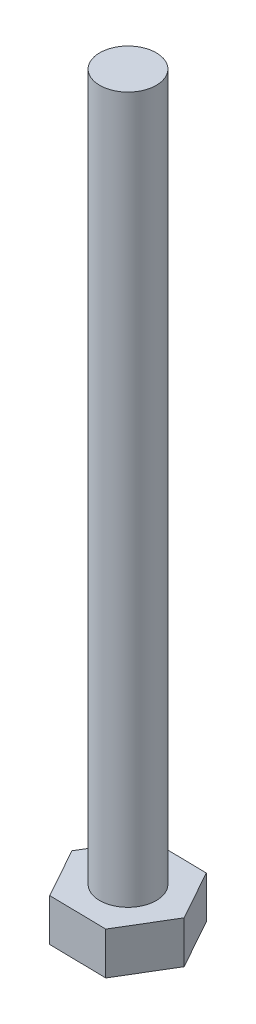
ISO-10303-21;
HEADER;
FILE_DESCRIPTION(('STEP AP214'),'2;1');
FILE_NAME('part.step','',(''),(''),'','','');
FILE_SCHEMA(('AUTOMOTIVE_DESIGN { 1 0 10303 214 1 1 1 1 }'));
ENDSEC;
DATA;
#1=APPLICATION_CONTEXT('core data for automotive mechanical design processes');
#2=APPLICATION_PROTOCOL_DEFINITION('international standard','automotive_design',2000,#1);
#3=PRODUCT_CONTEXT('',#1,'mechanical');
#4=PRODUCT('Part','Part','',(#3));
#5=PRODUCT_RELATED_PRODUCT_CATEGORY('part','',(#4));
#6=PRODUCT_DEFINITION_FORMATION('','',#4);
#7=PRODUCT_DEFINITION_CONTEXT('part definition',#1,'design');
#8=PRODUCT_DEFINITION('design','',#6,#7);
#9=PRODUCT_DEFINITION_SHAPE('','',#8);
#10=(LENGTH_UNIT() NAMED_UNIT(*) SI_UNIT(.MILLI.,.METRE.));
#11=(NAMED_UNIT(*) PLANE_ANGLE_UNIT() SI_UNIT($,.RADIAN.));
#12=(NAMED_UNIT(*) SI_UNIT($,.STERADIAN.) SOLID_ANGLE_UNIT());
#13=UNCERTAINTY_MEASURE_WITH_UNIT(LENGTH_MEASURE(1.E-05),#10,'distance_accuracy_value','');
#14=(GEOMETRIC_REPRESENTATION_CONTEXT(3) GLOBAL_UNCERTAINTY_ASSIGNED_CONTEXT((#13)) GLOBAL_UNIT_ASSIGNED_CONTEXT((#10,
#11,#12)) REPRESENTATION_CONTEXT('',''));
#15=CARTESIAN_POINT('',(0.,0.,0.));
#16=DIRECTION('',(0.,0.,1.));
#17=DIRECTION('',(1.,0.,0.));
#18=AXIS2_PLACEMENT_3D('',#15,#16,#17);
#19=CARTESIAN_POINT('',(-2.08174588782689,3.,3.46405360695373));
#20=DIRECTION('',(0.0175229154353276,0.,-0.999846461930354));
#21=DIRECTION('',(-0.999846461930354,0.,-0.0175229154353276));
#22=AXIS2_PLACEMENT_3D('',#19,#20,#21);
#23=PLANE('',#22);
#24=DIRECTION('',(0.999846461930354,0.,0.0175229154353276));
#25=VECTOR('',#24,1.);
#26=CARTESIAN_POINT('',(-2.08174588782689,0.,3.46405360695373));
#27=LINE('',#26,#25);
#28=CARTESIAN_POINT('',(-2.08174588782689,0.,3.46405360695373));
#29=VERTEX_POINT('',#28);
#30=CARTESIAN_POINT('',(1.9590854797796,0.,3.53487162655874));
#31=VERTEX_POINT('',#30);
#32=EDGE_CURVE('E123',#29,#31,#27,.T.);
#33=ORIENTED_EDGE('',*,*,#32,.T.);
#34=DIRECTION('',(0.,-1.,0.));
#35=VECTOR('',#34,1.);
#36=CARTESIAN_POINT('',(1.9590854797796,3.,3.53487162655874));
#37=LINE('',#36,#35);
#38=CARTESIAN_POINT('',(1.9590854797796,3.,3.53487162655874));
#39=VERTEX_POINT('',#38);
#40=EDGE_CURVE('E40',#39,#31,#37,.T.);
#41=ORIENTED_EDGE('',*,*,#40,.F.);
#42=DIRECTION('',(0.999846461930354,0.,0.0175229154353276));
#43=VECTOR('',#42,1.);
#44=CARTESIAN_POINT('',(-2.08174588782689,3.,3.46405360695373));
#45=LINE('',#44,#43);
#46=CARTESIAN_POINT('',(-2.08174588782689,3.,3.46405360695373));
#47=VERTEX_POINT('',#46);
#48=EDGE_CURVE('E134',#47,#39,#45,.T.);
#49=ORIENTED_EDGE('',*,*,#48,.F.);
#50=DIRECTION('',(0.,-1.,0.));
#51=VECTOR('',#50,1.);
#52=CARTESIAN_POINT('',(-2.08174588782689,3.,3.46405360695373));
#53=LINE('',#52,#51);
#54=EDGE_CURVE('E119',#47,#29,#53,.T.);
#55=ORIENTED_EDGE('',*,*,#54,.T.);
#56=EDGE_LOOP('',(#33,#41,#49,#55));
#57=FACE_BOUND('',#56,.T.);
#58=ADVANCED_FACE('F37',(#57),#23,.F.);
#59=CARTESIAN_POINT('',(1.9590854797796,3.,3.53487162655874));
#60=DIRECTION('',(-0.857130978198013,0.,-0.515098520880537));
#61=DIRECTION('',(-0.515098520880537,0.,0.857130978198013));
#62=AXIS2_PLACEMENT_3D('',#59,#60,#61);
#63=PLANE('',#62);
#64=DIRECTION('',(0.515098520880537,0.,-0.857130978198013));
#65=VECTOR('',#64,1.);
#66=CARTESIAN_POINT('',(1.9590854797796,0.,3.53487162655874));
#67=LINE('',#66,#65);
#68=CARTESIAN_POINT('',(4.04083136760649,0.,0.070818019605012));
#69=VERTEX_POINT('',#68);
#70=EDGE_CURVE('E126',#31,#69,#67,.T.);
#71=ORIENTED_EDGE('',*,*,#70,.T.);
#72=DIRECTION('',(0.,-1.,0.));
#73=VECTOR('',#72,1.);
#74=CARTESIAN_POINT('',(4.04083136760649,3.,0.070818019605012));
#75=LINE('',#74,#73);
#76=CARTESIAN_POINT('',(4.04083136760649,3.,0.070818019605012));
#77=VERTEX_POINT('',#76);
#78=EDGE_CURVE('E137',#77,#69,#75,.T.);
#79=ORIENTED_EDGE('',*,*,#78,.F.);
#80=DIRECTION('',(0.515098520880537,0.,-0.857130978198013));
#81=VECTOR('',#80,1.);
#82=CARTESIAN_POINT('',(1.9590854797796,3.,3.53487162655874));
#83=LINE('',#82,#81);
#84=EDGE_CURVE('E92',#39,#77,#83,.T.);
#85=ORIENTED_EDGE('',*,*,#84,.F.);
#86=ORIENTED_EDGE('',*,*,#40,.T.);
#87=EDGE_LOOP('',(#71,#79,#85,#86));
#88=FACE_BOUND('',#87,.T.);
#89=ADVANCED_FACE('F142',(#88),#63,.F.);
#90=CARTESIAN_POINT('',(4.04083136760649,3.,0.070818019605012));
#91=DIRECTION('',(-0.87465389363334,0.,0.484747941049817));
#92=DIRECTION('',(0.484747941049817,0.,0.874653893633341));
#93=AXIS2_PLACEMENT_3D('',#90,#91,#92);
#94=PLANE('',#93);
#95=DIRECTION('',(-0.484747941049817,0.,-0.874653893633341));
#96=VECTOR('',#95,1.);
#97=CARTESIAN_POINT('',(4.04083136760649,0.,0.070818019605012));
#98=LINE('',#97,#96);
#99=CARTESIAN_POINT('',(2.08174588782689,0.,-3.46405360695373));
#100=VERTEX_POINT('',#99);
#101=EDGE_CURVE('E129',#69,#100,#98,.T.);
#102=ORIENTED_EDGE('',*,*,#101,.T.);
#103=DIRECTION('',(0.,-1.,0.));
#104=VECTOR('',#103,1.);
#105=CARTESIAN_POINT('',(2.08174588782689,3.,-3.46405360695373));
#106=LINE('',#105,#104);
#107=CARTESIAN_POINT('',(2.08174588782689,3.,-3.46405360695373));
#108=VERTEX_POINT('',#107);
#109=EDGE_CURVE('E114',#108,#100,#106,.T.);
#110=ORIENTED_EDGE('',*,*,#109,.F.);
#111=DIRECTION('',(-0.484747941049817,0.,-0.874653893633341));
#112=VECTOR('',#111,1.);
#113=CARTESIAN_POINT('',(4.04083136760649,3.,0.070818019605012));
#114=LINE('',#113,#112);
#115=EDGE_CURVE('E105',#77,#108,#114,.T.);
#116=ORIENTED_EDGE('',*,*,#115,.F.);
#117=ORIENTED_EDGE('',*,*,#78,.T.);
#118=EDGE_LOOP('',(#102,#110,#116,#117));
#119=FACE_BOUND('',#118,.T.);
#120=ADVANCED_FACE('F148',(#119),#94,.F.);
#121=CARTESIAN_POINT('',(2.08174588782689,3.,-3.46405360695373));
#122=DIRECTION('',(-0.0175229154353273,0.,0.999846461930354));
#123=DIRECTION('',(0.999846461930354,0.,0.0175229154353273));
#124=AXIS2_PLACEMENT_3D('',#121,#122,#123);
#125=PLANE('',#124);
#126=DIRECTION('',(-0.999846461930354,0.,-0.0175229154353273));
#127=VECTOR('',#126,1.);
#128=CARTESIAN_POINT('',(2.08174588782689,0.,-3.46405360695373));
#129=LINE('',#128,#127);
#130=CARTESIAN_POINT('',(-1.9590854797796,0.,-3.53487162655875));
#131=VERTEX_POINT('',#130);
#132=EDGE_CURVE('E113',#100,#131,#129,.T.);
#133=ORIENTED_EDGE('',*,*,#132,.T.);
#134=DIRECTION('',(0.,-1.,0.));
#135=VECTOR('',#134,1.);
#136=CARTESIAN_POINT('',(-1.9590854797796,3.,-3.53487162655875));
#137=LINE('',#136,#135);
#138=CARTESIAN_POINT('',(-1.9590854797796,3.,-3.53487162655875));
#139=VERTEX_POINT('',#138);
#140=EDGE_CURVE('E110',#139,#131,#137,.T.);
#141=ORIENTED_EDGE('',*,*,#140,.F.);
#142=DIRECTION('',(-0.999846461930354,0.,-0.0175229154353273));
#143=VECTOR('',#142,1.);
#144=CARTESIAN_POINT('',(2.08174588782689,3.,-3.46405360695373));
#145=LINE('',#144,#143);
#146=EDGE_CURVE('E99',#108,#139,#145,.T.);
#147=ORIENTED_EDGE('',*,*,#146,.F.);
#148=ORIENTED_EDGE('',*,*,#109,.T.);
#149=EDGE_LOOP('',(#133,#141,#147,#148));
#150=FACE_BOUND('',#149,.T.);
#151=ADVANCED_FACE('F111',(#150),#125,.F.);
#152=CARTESIAN_POINT('',(-1.9590854797796,3.,-3.53487162655875));
#153=DIRECTION('',(0.857130978198013,0.,0.515098520880537));
#154=DIRECTION('',(0.515098520880537,0.,-0.857130978198013));
#155=AXIS2_PLACEMENT_3D('',#152,#153,#154);
#156=PLANE('',#155);
#157=DIRECTION('',(-0.515098520880537,0.,0.857130978198013));
#158=VECTOR('',#157,1.);
#159=CARTESIAN_POINT('',(-1.9590854797796,0.,-3.53487162655875));
#160=LINE('',#159,#158);
#161=CARTESIAN_POINT('',(-4.04083136760649,0.,-0.0708180196050144));
#162=VERTEX_POINT('',#161);
#163=EDGE_CURVE('E77',#131,#162,#160,.T.);
#164=ORIENTED_EDGE('',*,*,#163,.T.);
#165=DIRECTION('',(0.,-1.,0.));
#166=VECTOR('',#165,1.);
#167=CARTESIAN_POINT('',(-4.04083136760649,3.,-0.0708180196050144));
#168=LINE('',#167,#166);
#169=CARTESIAN_POINT('',(-4.04083136760649,3.,-0.0708180196050144));
#170=VERTEX_POINT('',#169);
#171=EDGE_CURVE('E115',#170,#162,#168,.T.);
#172=ORIENTED_EDGE('',*,*,#171,.F.);
#173=DIRECTION('',(-0.515098520880537,0.,0.857130978198013));
#174=VECTOR('',#173,1.);
#175=CARTESIAN_POINT('',(-1.9590854797796,3.,-3.53487162655875));
#176=LINE('',#175,#174);
#177=EDGE_CURVE('E103',#139,#170,#176,.T.);
#178=ORIENTED_EDGE('',*,*,#177,.F.);
#179=ORIENTED_EDGE('',*,*,#140,.T.);
#180=EDGE_LOOP('',(#164,#172,#178,#179));
#181=FACE_BOUND('',#180,.T.);
#182=ADVANCED_FACE('F117',(#181),#156,.F.);
#183=CARTESIAN_POINT('',(-4.04083136760649,3.,-0.0708180196050144));
#184=DIRECTION('',(0.874653893633341,0.,-0.484747941049817));
#185=DIRECTION('',(-0.484747941049817,0.,-0.874653893633341));
#186=AXIS2_PLACEMENT_3D('',#183,#184,#185);
#187=PLANE('',#186);
#188=DIRECTION('',(0.484747941049817,0.,0.874653893633341));
#189=VECTOR('',#188,1.);
#190=CARTESIAN_POINT('',(-4.04083136760649,0.,-0.0708180196050144));
#191=LINE('',#190,#189);
#192=EDGE_CURVE('E83',#162,#29,#191,.T.);
#193=ORIENTED_EDGE('',*,*,#192,.T.);
#194=ORIENTED_EDGE('',*,*,#54,.F.);
#195=DIRECTION('',(0.484747941049817,0.,0.874653893633341));
#196=VECTOR('',#195,1.);
#197=CARTESIAN_POINT('',(-4.04083136760649,3.,-0.0708180196050144));
#198=LINE('',#197,#196);
#199=EDGE_CURVE('E54',#170,#47,#198,.T.);
#200=ORIENTED_EDGE('',*,*,#199,.F.);
#201=ORIENTED_EDGE('',*,*,#171,.T.);
#202=EDGE_LOOP('',(#193,#194,#200,#201));
#203=FACE_BOUND('',#202,.T.);
#204=ADVANCED_FACE('F164',(#203),#187,.F.);
#205=CARTESIAN_POINT('',(0.,3.,0.));
#206=DIRECTION('',(0.,1.,0.));
#207=DIRECTION('',(0.,0.,1.));
#208=AXIS2_PLACEMENT_3D('',#205,#206,#207);
#209=PLANE('',#208);
#210=CARTESIAN_POINT('',(0.,3.,0.));
#211=DIRECTION('',(0.,1.,0.));
#212=DIRECTION('',(0.,0.,1.));
#213=AXIS2_PLACEMENT_3D('',#210,#211,#212);
#214=CIRCLE('',#213,2.);
#215=CARTESIAN_POINT('',(0.,3.,2.));
#216=VERTEX_POINT('',#215);
#217=EDGE_CURVE('E11',#216,#216,#214,.T.);
#218=ORIENTED_EDGE('',*,*,#217,.F.);
#219=EDGE_LOOP('',(#218));
#220=FACE_BOUND('',#219,.T.);
#221=ORIENTED_EDGE('',*,*,#48,.T.);
#222=ORIENTED_EDGE('',*,*,#84,.T.);
#223=ORIENTED_EDGE('',*,*,#115,.T.);
#224=ORIENTED_EDGE('',*,*,#146,.T.);
#225=ORIENTED_EDGE('',*,*,#177,.T.);
#226=ORIENTED_EDGE('',*,*,#199,.T.);
#227=EDGE_LOOP('',(#221,#222,#223,#224,#225,#226));
#228=FACE_BOUND('',#227,.T.);
#229=ADVANCED_FACE('F101',(#220,#228),#209,.T.);
#230=CARTESIAN_POINT('',(0.,0.,0.));
#231=DIRECTION('',(0.,1.,0.));
#232=DIRECTION('',(0.,0.,1.));
#233=AXIS2_PLACEMENT_3D('',#230,#231,#232);
#234=PLANE('',#233);
#235=ORIENTED_EDGE('',*,*,#32,.F.);
#236=ORIENTED_EDGE('',*,*,#192,.F.);
#237=ORIENTED_EDGE('',*,*,#163,.F.);
#238=ORIENTED_EDGE('',*,*,#132,.F.);
#239=ORIENTED_EDGE('',*,*,#101,.F.);
#240=ORIENTED_EDGE('',*,*,#70,.F.);
#241=EDGE_LOOP('',(#235,#236,#237,#238,#239,#240));
#242=FACE_BOUND('',#241,.T.);
#243=ADVANCED_FACE('F147',(#242),#234,.F.);
#244=CARTESIAN_POINT('',(0.,53.,0.));
#245=DIRECTION('',(0.,-1.,0.));
#246=DIRECTION('',(0.,0.,-1.));
#247=AXIS2_PLACEMENT_3D('',#244,#245,#246);
#248=CYLINDRICAL_SURFACE('',#247,2.);
#249=CARTESIAN_POINT('',(0.,53.,0.));
#250=DIRECTION('',(0.,1.,0.));
#251=DIRECTION('',(0.,0.,1.));
#252=AXIS2_PLACEMENT_3D('',#249,#250,#251);
#253=CIRCLE('',#252,2.);
#254=CARTESIAN_POINT('',(0.,53.,2.));
#255=VERTEX_POINT('',#254);
#256=EDGE_CURVE('E127',#255,#255,#253,.T.);
#257=ORIENTED_EDGE('',*,*,#256,.F.);
#258=EDGE_LOOP('',(#257));
#259=FACE_BOUND('',#258,.T.);
#260=ORIENTED_EDGE('',*,*,#217,.T.);
#261=EDGE_LOOP('',(#260));
#262=FACE_BOUND('',#261,.T.);
#263=ADVANCED_FACE('F157',(#259,#262),#248,.T.);
#264=CARTESIAN_POINT('',(0.,53.,0.));
#265=DIRECTION('',(0.,1.,0.));
#266=DIRECTION('',(0.,0.,1.));
#267=AXIS2_PLACEMENT_3D('',#264,#265,#266);
#268=PLANE('',#267);
#269=ORIENTED_EDGE('',*,*,#256,.T.);
#270=EDGE_LOOP('',(#269));
#271=FACE_BOUND('',#270,.T.);
#272=ADVANCED_FACE('F155',(#271),#268,.T.);
#273=CLOSED_SHELL('',(#58,#89,#120,#151,#182,#204,#229,#243,#263,#272));
#274=MANIFOLD_SOLID_BREP('B2',#273);
#275=ADVANCED_BREP_SHAPE_REPRESENTATION('',(#18,#274),#14);
#276=SHAPE_DEFINITION_REPRESENTATION(#9,#275);
ENDSEC;
END-ISO-10303-21;
